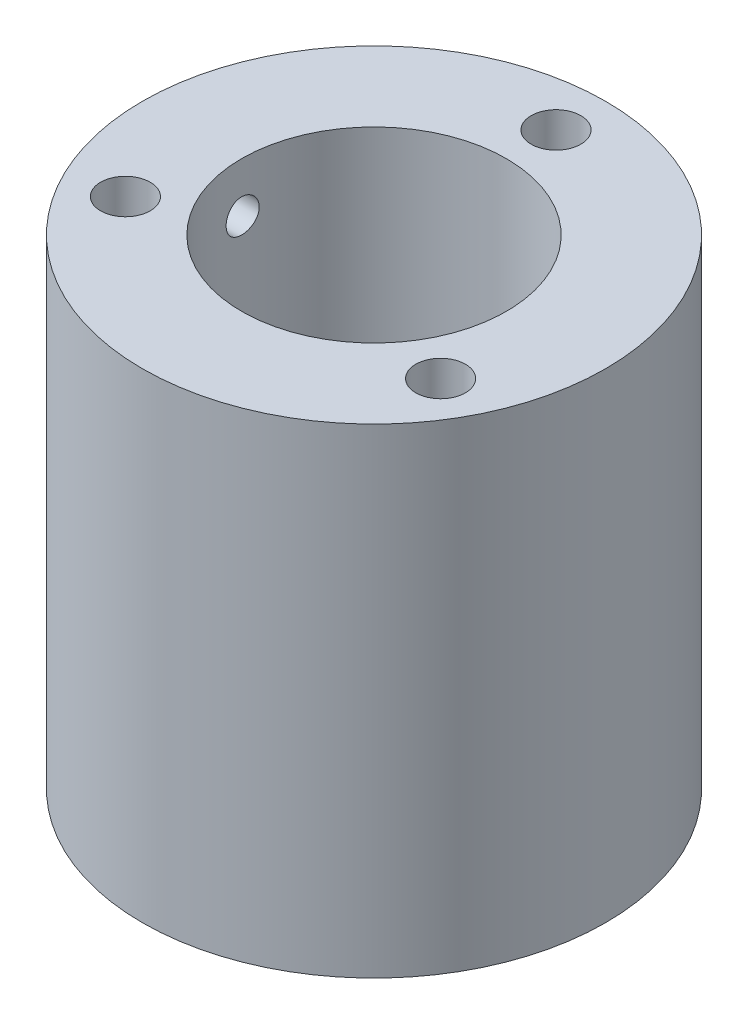
ISO-10303-21;
HEADER;
FILE_DESCRIPTION(('STEP AP214'),'2;1');
FILE_NAME('part.step','',(''),(''),'','','');
FILE_SCHEMA(('AUTOMOTIVE_DESIGN { 1 0 10303 214 1 1 1 1 }'));
ENDSEC;
DATA;
#1=APPLICATION_CONTEXT('core data for automotive mechanical design processes');
#2=APPLICATION_PROTOCOL_DEFINITION('international standard','automotive_design',2000,#1);
#3=PRODUCT_CONTEXT('',#1,'mechanical');
#4=PRODUCT('Part','Part','',(#3));
#5=PRODUCT_RELATED_PRODUCT_CATEGORY('part','',(#4));
#6=PRODUCT_DEFINITION_FORMATION('','',#4);
#7=PRODUCT_DEFINITION_CONTEXT('part definition',#1,'design');
#8=PRODUCT_DEFINITION('design','',#6,#7);
#9=PRODUCT_DEFINITION_SHAPE('','',#8);
#10=(LENGTH_UNIT() NAMED_UNIT(*) SI_UNIT(.MILLI.,.METRE.));
#11=(NAMED_UNIT(*) PLANE_ANGLE_UNIT() SI_UNIT($,.RADIAN.));
#12=(NAMED_UNIT(*) SI_UNIT($,.STERADIAN.) SOLID_ANGLE_UNIT());
#13=UNCERTAINTY_MEASURE_WITH_UNIT(LENGTH_MEASURE(1.E-05),#10,'distance_accuracy_value','');
#14=(GEOMETRIC_REPRESENTATION_CONTEXT(3) GLOBAL_UNCERTAINTY_ASSIGNED_CONTEXT((#13)) GLOBAL_UNIT_ASSIGNED_CONTEXT((#10,
#11,#12)) REPRESENTATION_CONTEXT('',''));
#15=CARTESIAN_POINT('',(0.,0.,0.));
#16=DIRECTION('',(0.,0.,1.));
#17=DIRECTION('',(1.,0.,0.));
#18=AXIS2_PLACEMENT_3D('',#15,#16,#17);
#19=CARTESIAN_POINT('',(0.,0.,0.));
#20=DIRECTION('',(0.,-1.,0.));
#21=DIRECTION('',(1.,0.,0.));
#22=AXIS2_PLACEMENT_3D('',#19,#20,#21);
#23=CYLINDRICAL_SURFACE('',#22,3.);
#24=CARTESIAN_POINT('',(0.,0.,0.));
#25=DIRECTION('',(0.,-1.,0.));
#26=DIRECTION('',(1.,0.,0.));
#27=AXIS2_PLACEMENT_3D('',#24,#25,#26);
#28=CIRCLE('',#27,3.);
#29=CARTESIAN_POINT('',(3.,0.,0.));
#30=VERTEX_POINT('',#29);
#31=EDGE_CURVE('E10',#30,#30,#28,.T.);
#32=ORIENTED_EDGE('',*,*,#31,.T.);
#33=EDGE_LOOP('',(#32));
#34=FACE_BOUND('',#33,.T.);
#35=CARTESIAN_POINT('',(0.,7.,0.));
#36=DIRECTION('',(0.,1.,0.));
#37=DIRECTION('',(-1.,0.,0.));
#38=AXIS2_PLACEMENT_3D('',#35,#36,#37);
#39=CIRCLE('',#38,3.);
#40=CARTESIAN_POINT('',(-3.,7.,0.));
#41=VERTEX_POINT('',#40);
#42=EDGE_CURVE('E51',#41,#41,#39,.T.);
#43=ORIENTED_EDGE('',*,*,#42,.T.);
#44=EDGE_LOOP('',(#43));
#45=FACE_BOUND('',#44,.T.);
#46=ADVANCED_FACE('F31',(#34,#45),#23,.F.);
#47=CARTESIAN_POINT('',(8.,0.,0.));
#48=DIRECTION('',(0.,-1.,0.));
#49=DIRECTION('',(1.,0.,0.));
#50=AXIS2_PLACEMENT_3D('',#47,#48,#49);
#51=PLANE('',#50);
#52=CARTESIAN_POINT('',(0.,0.,0.));
#53=DIRECTION('',(0.,-1.,0.));
#54=DIRECTION('',(1.,0.,0.));
#55=AXIS2_PLACEMENT_3D('',#52,#53,#54);
#56=CIRCLE('',#55,8.);
#57=CARTESIAN_POINT('',(8.,0.,0.));
#58=VERTEX_POINT('',#57);
#59=EDGE_CURVE('E82',#58,#58,#56,.T.);
#60=ORIENTED_EDGE('',*,*,#59,.T.);
#61=EDGE_LOOP('',(#60));
#62=FACE_BOUND('',#61,.T.);
#63=ORIENTED_EDGE('',*,*,#31,.F.);
#64=EDGE_LOOP('',(#63));
#65=FACE_BOUND('',#64,.T.);
#66=ADVANCED_FACE('F33',(#62,#65),#51,.T.);
#67=CARTESIAN_POINT('',(8.,30.5,0.));
#68=DIRECTION('',(0.,1.,0.));
#69=DIRECTION('',(-1.,0.,0.));
#70=AXIS2_PLACEMENT_3D('',#67,#68,#69);
#71=PLANE('',#70);
#72=CARTESIAN_POINT('',(-9.52627944162812,30.5,5.50000000000041));
#73=DIRECTION('',(0.,1.,0.));
#74=DIRECTION('',(-1.,0.,0.));
#75=AXIS2_PLACEMENT_3D('',#72,#73,#74);
#76=CIRCLE('',#75,1.50000000000089);
#77=CARTESIAN_POINT('',(-11.026279441629,30.5,5.50000000000041));
#78=VERTEX_POINT('',#77);
#79=EDGE_CURVE('E53',#78,#78,#76,.T.);
#80=ORIENTED_EDGE('',*,*,#79,.F.);
#81=EDGE_LOOP('',(#80));
#82=FACE_BOUND('',#81,.T.);
#83=CARTESIAN_POINT('',(9.52627944162952,30.5,5.49999999999959));
#84=DIRECTION('',(0.,1.,0.));
#85=DIRECTION('',(-1.,0.,0.));
#86=AXIS2_PLACEMENT_3D('',#83,#84,#85);
#87=CIRCLE('',#86,1.50000000000061);
#88=CARTESIAN_POINT('',(8.02627944162892,30.5,5.49999999999959));
#89=VERTEX_POINT('',#88);
#90=EDGE_CURVE('E71',#89,#89,#87,.T.);
#91=ORIENTED_EDGE('',*,*,#90,.F.);
#92=EDGE_LOOP('',(#91));
#93=FACE_BOUND('',#92,.T.);
#94=CARTESIAN_POINT('',(0.,30.5,-11.));
#95=DIRECTION('',(0.,1.,0.));
#96=DIRECTION('',(-1.,0.,0.));
#97=AXIS2_PLACEMENT_3D('',#94,#95,#96);
#98=CIRCLE('',#97,1.5);
#99=CARTESIAN_POINT('',(-1.5,30.5,-11.));
#100=VERTEX_POINT('',#99);
#101=EDGE_CURVE('E76',#100,#100,#98,.T.);
#102=ORIENTED_EDGE('',*,*,#101,.F.);
#103=EDGE_LOOP('',(#102));
#104=FACE_BOUND('',#103,.T.);
#105=CARTESIAN_POINT('',(0.,30.5,0.));
#106=DIRECTION('',(0.,1.,0.));
#107=DIRECTION('',(-1.,0.,0.));
#108=AXIS2_PLACEMENT_3D('',#105,#106,#107);
#109=CIRCLE('',#108,8.);
#110=CARTESIAN_POINT('',(-8.,30.5,0.));
#111=VERTEX_POINT('',#110);
#112=EDGE_CURVE('E54',#111,#111,#109,.T.);
#113=ORIENTED_EDGE('',*,*,#112,.F.);
#114=EDGE_LOOP('',(#113));
#115=FACE_BOUND('',#114,.T.);
#116=CARTESIAN_POINT('',(0.,30.5,0.));
#117=DIRECTION('',(0.,-1.,0.));
#118=DIRECTION('',(1.,0.,0.));
#119=AXIS2_PLACEMENT_3D('',#116,#117,#118);
#120=CIRCLE('',#119,14.);
#121=CARTESIAN_POINT('',(14.,30.5,0.));
#122=VERTEX_POINT('',#121);
#123=EDGE_CURVE('E43',#122,#122,#120,.T.);
#124=ORIENTED_EDGE('',*,*,#123,.F.);
#125=EDGE_LOOP('',(#124));
#126=FACE_BOUND('',#125,.T.);
#127=ADVANCED_FACE('F97',(#82,#93,#104,#115,#126),#71,.T.);
#128=CARTESIAN_POINT('',(0.,0.,0.));
#129=DIRECTION('',(0.,-1.,0.));
#130=DIRECTION('',(1.,0.,0.));
#131=AXIS2_PLACEMENT_3D('',#128,#129,#130);
#132=CYLINDRICAL_SURFACE('',#131,14.);
#133=CARTESIAN_POINT('',(-13.9642400437689,27.5,-1.));
#134=CARTESIAN_POINT('',(-13.9642405203937,27.4439064862475,-0.999997538488355));
#135=CARTESIAN_POINT('',(-13.9645816664233,27.3877741240776,-0.995264409071027));
#136=CARTESIAN_POINT('',(-13.9659094817195,27.2770605944301,-0.976451657186973));
#137=CARTESIAN_POINT('',(-13.9668968944852,27.2224812892277,-0.962361269366147));
#138=CARTESIAN_POINT('',(-13.9694048346482,27.1164935210599,-0.925241893623878));
#139=CARTESIAN_POINT('',(-13.970925072399,27.065083353152,-0.902217761409243));
#140=CARTESIAN_POINT('',(-13.9743270033516,26.966870379804,-0.847892642183158));
#141=CARTESIAN_POINT('',(-13.9762086159273,26.9200665501602,-0.816593500822899));
#142=CARTESIAN_POINT('',(-13.9801253596357,26.8322919265856,-0.746541374331525));
#143=CARTESIAN_POINT('',(-13.9821607462646,26.791331182139,-0.707775810498677));
#144=CARTESIAN_POINT('',(-13.9861533396418,26.7164916147968,-0.623917545596144));
#145=CARTESIAN_POINT('',(-13.988110543066,26.6826130927471,-0.578824575880428));
#146=CARTESIAN_POINT('',(-13.9917285514192,26.6228675767621,-0.483533293162495));
#147=CARTESIAN_POINT('',(-13.9933890414199,26.5970090740229,-0.43332964339063));
#148=CARTESIAN_POINT('',(-13.9962238066368,26.5540919608081,-0.329279441658636));
#149=CARTESIAN_POINT('',(-13.9973980883565,26.5370332326255,-0.275432938436658));
#150=CARTESIAN_POINT('',(-13.9991263510329,26.512228271237,-0.165723869393624));
#151=CARTESIAN_POINT('',(-13.9996813966491,26.5044660527448,-0.109864934843977));
#152=CARTESIAN_POINT('',(-14.0001122433894,26.4984250657182,0.0023655614120201));
#153=CARTESIAN_POINT('',(-13.9999880541307,26.5001461629123,0.0587371158490495));
#154=CARTESIAN_POINT('',(-13.9990753083075,26.5130098126578,0.170284352160479));
#155=CARTESIAN_POINT('',(-13.9982879641018,26.5241351727683,0.225462027967625));
#156=CARTESIAN_POINT('',(-13.9961389118663,26.5554648393326,0.333164758427453));
#157=CARTESIAN_POINT('',(-13.9947771996163,26.5756692124931,0.385689793587067));
#158=CARTESIAN_POINT('',(-13.9916305924559,26.6246027249088,0.486651254042147));
#159=CARTESIAN_POINT('',(-13.9898453128611,26.6533396194095,0.535083908088336));
#160=CARTESIAN_POINT('',(-13.986052376203,26.7185168035681,0.626444607533954));
#161=CARTESIAN_POINT('',(-13.9840447158462,26.7549572073268,0.669372571385366));
#162=CARTESIAN_POINT('',(-13.9800275472914,26.8346040209237,0.748605738244498));
#163=CARTESIAN_POINT('',(-13.9780180449804,26.8778253596881,0.784895936370593));
#164=CARTESIAN_POINT('',(-13.9742282177889,26.9697549548497,0.849707645100839));
#165=CARTESIAN_POINT('',(-13.9724478930328,27.0184632142245,0.878229151489125));
#166=CARTESIAN_POINT('',(-13.9693175502356,27.1199939335926,0.926692983635403));
#167=CARTESIAN_POINT('',(-13.9679675667899,27.1728167239321,0.946634619695545));
#168=CARTESIAN_POINT('',(-13.9658513103158,27.2810724318437,0.977361987844122));
#169=CARTESIAN_POINT('',(-13.9650850283022,27.3365053092244,0.988147860869645));
#170=CARTESIAN_POINT('',(-13.9642242865475,27.4482766081982,1.00023871930709));
#171=CARTESIAN_POINT('',(-13.9641283469661,27.5046127597684,1.00156458865312));
#172=CARTESIAN_POINT('',(-13.9646152408324,27.6167066025047,0.994752423331228));
#173=CARTESIAN_POINT('',(-13.9651980696495,27.6724642976146,0.986614453227001));
#174=CARTESIAN_POINT('',(-13.9669754738103,27.7817590629912,0.961122988518048));
#175=CARTESIAN_POINT('',(-13.9681694072923,27.8352983996157,0.943779162396539));
#176=CARTESIAN_POINT('',(-13.9710339443197,27.9387067158408,0.900378119737884));
#177=CARTESIAN_POINT('',(-13.9727045535057,27.9885756520002,0.87432080009193));
#178=CARTESIAN_POINT('',(-13.9763377819845,28.0833233590535,0.814179279780773));
#179=CARTESIAN_POINT('',(-13.9783009070333,28.128193247059,0.780081115906834));
#180=CARTESIAN_POINT('',(-13.9822962110106,28.2115795677299,0.704846089297059));
#181=CARTESIAN_POINT('',(-13.9843283908157,28.2500959196995,0.663709137175631));
#182=CARTESIAN_POINT('',(-13.9882371791169,28.3197526658179,0.575474234520167));
#183=CARTESIAN_POINT('',(-13.9901134980917,28.3508795242768,0.528365583706534));
#184=CARTESIAN_POINT('',(-13.9934949867277,28.4047809869096,0.429578135653666));
#185=CARTESIAN_POINT('',(-13.9950001592429,28.4275556553073,0.377899373559921));
#186=CARTESIAN_POINT('',(-13.9974684015413,28.4640828203073,0.2714879380357));
#187=CARTESIAN_POINT('',(-13.9984319812725,28.4778438059549,0.216758190886675));
#188=CARTESIAN_POINT('',(-13.9997105173473,28.4959807487734,0.105757897323166));
#189=CARTESIAN_POINT('',(-14.0000254823903,28.5003568318186,0.0494873715845268));
#190=CARTESIAN_POINT('',(-13.9999713228965,28.4995984418556,-0.0628634206029759));
#191=CARTESIAN_POINT('',(-13.999603719472,28.4944851161253,-0.118943831754038));
#192=CARTESIAN_POINT('',(-13.998228758943,28.4749370045103,-0.229447486667536));
#193=CARTESIAN_POINT('',(-13.9972214008013,28.4605022035118,-0.283870727742869));
#194=CARTESIAN_POINT('',(-13.9946800742266,28.4227259259988,-0.38951757941589));
#195=CARTESIAN_POINT('',(-13.9931461184151,28.3993846629522,-0.4407412666654));
#196=CARTESIAN_POINT('',(-13.989723581538,28.3444606980534,-0.538545901074291));
#197=CARTESIAN_POINT('',(-13.987835008249,28.3128781769217,-0.58512695000989));
#198=CARTESIAN_POINT('',(-13.983910483972,28.2422892971614,-0.672431852610341));
#199=CARTESIAN_POINT('',(-13.9818742311411,28.2032674522789,-0.713143171291755));
#200=CARTESIAN_POINT('',(-13.9778863554286,28.1189322512332,-0.787452691686209));
#201=CARTESIAN_POINT('',(-13.9759347532911,28.0736173642239,-0.821049157603013));
#202=CARTESIAN_POINT('',(-13.9723339518161,27.9779165691704,-0.880208141511714));
#203=CARTESIAN_POINT('',(-13.970685206218,27.9275232246992,-0.905758645297685));
#204=CARTESIAN_POINT('',(-13.9678824747005,27.8231858117285,-0.948004002630864));
#205=CARTESIAN_POINT('',(-13.9667279137906,27.7692459544418,-0.96470915325774));
#206=CARTESIAN_POINT('',(-13.9653446437272,27.6791505177616,-0.984481986906043));
#207=CARTESIAN_POINT('',(-13.9649322905572,27.6435762208054,-0.990293634496187));
#208=CARTESIAN_POINT('',(-13.9643798378402,27.5720066191317,-0.998053427544209));
#209=CARTESIAN_POINT('',(-13.964239737782,27.536011315205,-1.00000158025885));
#210=CARTESIAN_POINT('',(-13.9642400437689,27.5,-1.));
#211=B_SPLINE_CURVE_WITH_KNOTS('',3,(#133,#134,#135,#136,#137,#138,#139,#140,#141,#142,#143,
#144,#145,#146,#147,#148,#149,#150,#151,#152,#153,#154,#155,#156,#157,#158,#159,#160,#161,#162,
#163,#164,#165,#166,#167,#168,#169,#170,#171,#172,#173,#174,#175,#176,#177,#178,#179,#180,#181,
#182,#183,#184,#185,#186,#187,#188,#189,#190,#191,#192,#193,#194,#195,#196,#197,#198,#199,#200,
#201,#202,#203,#204,#205,#206,#207,#208,#209,#210),.UNSPECIFIED.,.T.,.F.,(4,2,2,2,2,2,2,2,2,2,2,
2,2,2,2,2,2,2,2,2,2,2,2,2,2,2,2,2,2,2,2,2,2,2,2,2,2,2,4),(0.,0.168149069736299,
0.336491927811284,0.504743415339148,0.672957407806302,0.841457309614469,1.00996436767829,
1.17864922833733,1.34733183258856,1.51572396988245,1.6841137229665,1.85219629776977,
2.02028010755697,2.18851715955513,2.35675670357604,2.52537198094741,2.69398734982168,
2.86261627040885,3.03124259519923,3.19949654447378,3.36774934590182,3.53582578785858,
3.70390421877356,3.87227670153391,4.04065132261562,4.20933202405057,4.37801142839446,
4.54653174195183,4.7150497952273,4.88319275459045,5.05133598658302,5.21947518881614,
5.38761070427967,5.55610012238256,5.72463059927318,5.89341154501829,6.06199557457905,
6.16994531992751,6.27789486251478),.UNSPECIFIED.);
#212=CARTESIAN_POINT('',(-13.9642400437689,27.5,-1.));
#213=VERTEX_POINT('',#212);
#214=EDGE_CURVE('E66',#213,#213,#211,.T.);
#215=ORIENTED_EDGE('',*,*,#214,.F.);
#216=EDGE_LOOP('',(#215));
#217=FACE_BOUND('',#216,.T.);
#218=ORIENTED_EDGE('',*,*,#123,.T.);
#219=EDGE_LOOP('',(#218));
#220=FACE_BOUND('',#219,.T.);
#221=CARTESIAN_POINT('',(0.,1.5,0.));
#222=DIRECTION('',(0.,-1.,0.));
#223=DIRECTION('',(1.,0.,0.));
#224=AXIS2_PLACEMENT_3D('',#221,#222,#223);
#225=CIRCLE('',#224,14.);
#226=CARTESIAN_POINT('',(14.,1.5,0.));
#227=VERTEX_POINT('',#226);
#228=EDGE_CURVE('E48',#227,#227,#225,.T.);
#229=ORIENTED_EDGE('',*,*,#228,.F.);
#230=EDGE_LOOP('',(#229));
#231=FACE_BOUND('',#230,.T.);
#232=ADVANCED_FACE('F95',(#217,#220,#231),#132,.T.);
#233=CARTESIAN_POINT('',(8.,1.5,0.));
#234=DIRECTION('',(0.,-1.,0.));
#235=DIRECTION('',(1.,0.,0.));
#236=AXIS2_PLACEMENT_3D('',#233,#234,#235);
#237=PLANE('',#236);
#238=ORIENTED_EDGE('',*,*,#228,.T.);
#239=EDGE_LOOP('',(#238));
#240=FACE_BOUND('',#239,.T.);
#241=CARTESIAN_POINT('',(0.,1.5,0.));
#242=DIRECTION('',(0.,-1.,0.));
#243=DIRECTION('',(1.,0.,0.));
#244=AXIS2_PLACEMENT_3D('',#241,#242,#243);
#245=CIRCLE('',#244,8.);
#246=CARTESIAN_POINT('',(8.,1.5,0.));
#247=VERTEX_POINT('',#246);
#248=EDGE_CURVE('E87',#247,#247,#245,.T.);
#249=ORIENTED_EDGE('',*,*,#248,.F.);
#250=EDGE_LOOP('',(#249));
#251=FACE_BOUND('',#250,.T.);
#252=ADVANCED_FACE('F92',(#240,#251),#237,.T.);
#253=CARTESIAN_POINT('',(0.,0.,0.));
#254=DIRECTION('',(0.,-1.,0.));
#255=DIRECTION('',(1.,0.,0.));
#256=AXIS2_PLACEMENT_3D('',#253,#254,#255);
#257=CYLINDRICAL_SURFACE('',#256,8.);
#258=ORIENTED_EDGE('',*,*,#248,.T.);
#259=EDGE_LOOP('',(#258));
#260=FACE_BOUND('',#259,.T.);
#261=ORIENTED_EDGE('',*,*,#59,.F.);
#262=EDGE_LOOP('',(#261));
#263=FACE_BOUND('',#262,.T.);
#264=ADVANCED_FACE('F105',(#260,#263),#257,.T.);
#265=CARTESIAN_POINT('',(0.,20.5,-11.));
#266=DIRECTION('',(0.,1.,0.));
#267=DIRECTION('',(-1.,0.,0.));
#268=AXIS2_PLACEMENT_3D('',#265,#266,#267);
#269=CYLINDRICAL_SURFACE('',#268,1.5);
#270=CARTESIAN_POINT('',(0.,20.5,-11.));
#271=DIRECTION('',(0.,1.,0.));
#272=DIRECTION('',(-1.,0.,0.));
#273=AXIS2_PLACEMENT_3D('',#270,#271,#272);
#274=CIRCLE('',#273,1.5);
#275=CARTESIAN_POINT('',(-1.5,20.5,-11.));
#276=VERTEX_POINT('',#275);
#277=EDGE_CURVE('E79',#276,#276,#274,.T.);
#278=ORIENTED_EDGE('',*,*,#277,.F.);
#279=EDGE_LOOP('',(#278));
#280=FACE_BOUND('',#279,.T.);
#281=ORIENTED_EDGE('',*,*,#101,.T.);
#282=EDGE_LOOP('',(#281));
#283=FACE_BOUND('',#282,.T.);
#284=ADVANCED_FACE('F126',(#280,#283),#269,.F.);
#285=CARTESIAN_POINT('',(0.,20.5,-11.));
#286=DIRECTION('',(0.,1.,0.));
#287=DIRECTION('',(-1.,0.,0.));
#288=AXIS2_PLACEMENT_3D('',#285,#286,#287);
#289=PLANE('',#288);
#290=ORIENTED_EDGE('',*,*,#277,.T.);
#291=EDGE_LOOP('',(#290));
#292=FACE_BOUND('',#291,.T.);
#293=ADVANCED_FACE('F132',(#292),#289,.T.);
#294=CARTESIAN_POINT('',(9.52627944162953,20.5,5.49999999999959));
#295=DIRECTION('',(0.,1.,0.));
#296=DIRECTION('',(-1.,0.,0.));
#297=AXIS2_PLACEMENT_3D('',#294,#295,#296);
#298=CYLINDRICAL_SURFACE('',#297,1.50000000000061);
#299=CARTESIAN_POINT('',(9.52627944162953,20.5,5.49999999999959));
#300=DIRECTION('',(0.,1.,0.));
#301=DIRECTION('',(-1.,0.,0.));
#302=AXIS2_PLACEMENT_3D('',#299,#300,#301);
#303=CIRCLE('',#302,1.50000000000061);
#304=CARTESIAN_POINT('',(8.02627944162892,20.5,5.49999999999959));
#305=VERTEX_POINT('',#304);
#306=EDGE_CURVE('E73',#305,#305,#303,.T.);
#307=ORIENTED_EDGE('',*,*,#306,.F.);
#308=EDGE_LOOP('',(#307));
#309=FACE_BOUND('',#308,.T.);
#310=ORIENTED_EDGE('',*,*,#90,.T.);
#311=EDGE_LOOP('',(#310));
#312=FACE_BOUND('',#311,.T.);
#313=ADVANCED_FACE('F138',(#309,#312),#298,.F.);
#314=CARTESIAN_POINT('',(9.52627944162953,20.5,5.49999999999959));
#315=DIRECTION('',(0.,1.,0.));
#316=DIRECTION('',(-1.,0.,0.));
#317=AXIS2_PLACEMENT_3D('',#314,#315,#316);
#318=PLANE('',#317);
#319=ORIENTED_EDGE('',*,*,#306,.T.);
#320=EDGE_LOOP('',(#319));
#321=FACE_BOUND('',#320,.T.);
#322=ADVANCED_FACE('F142',(#321),#318,.T.);
#323=CARTESIAN_POINT('',(-9.52627944162812,20.5,5.50000000000041));
#324=DIRECTION('',(0.,1.,0.));
#325=DIRECTION('',(-1.,0.,0.));
#326=AXIS2_PLACEMENT_3D('',#323,#324,#325);
#327=CYLINDRICAL_SURFACE('',#326,1.50000000000089);
#328=CARTESIAN_POINT('',(-9.52627944162812,20.5,5.50000000000041));
#329=DIRECTION('',(0.,1.,0.));
#330=DIRECTION('',(-1.,0.,0.));
#331=AXIS2_PLACEMENT_3D('',#328,#329,#330);
#332=CIRCLE('',#331,1.50000000000089);
#333=CARTESIAN_POINT('',(-11.026279441629,20.5,5.50000000000041));
#334=VERTEX_POINT('',#333);
#335=EDGE_CURVE('E58',#334,#334,#332,.T.);
#336=ORIENTED_EDGE('',*,*,#335,.F.);
#337=EDGE_LOOP('',(#336));
#338=FACE_BOUND('',#337,.T.);
#339=ORIENTED_EDGE('',*,*,#79,.T.);
#340=EDGE_LOOP('',(#339));
#341=FACE_BOUND('',#340,.T.);
#342=ADVANCED_FACE('F146',(#338,#341),#327,.F.);
#343=CARTESIAN_POINT('',(-9.52627944162812,20.5,5.50000000000041));
#344=DIRECTION('',(0.,1.,0.));
#345=DIRECTION('',(-1.,0.,0.));
#346=AXIS2_PLACEMENT_3D('',#343,#344,#345);
#347=PLANE('',#346);
#348=ORIENTED_EDGE('',*,*,#335,.T.);
#349=EDGE_LOOP('',(#348));
#350=FACE_BOUND('',#349,.T.);
#351=ADVANCED_FACE('F150',(#350),#347,.T.);
#352=CARTESIAN_POINT('',(0.,7.,0.));
#353=DIRECTION('',(0.,1.,0.));
#354=DIRECTION('',(-1.,0.,0.));
#355=AXIS2_PLACEMENT_3D('',#352,#353,#354);
#356=CYLINDRICAL_SURFACE('',#355,8.);
#357=CARTESIAN_POINT('',(-8.,26.5,0.));
#358=CARTESIAN_POINT('',(-7.99999921958572,26.5000023763743,0.0559364382223044));
#359=CARTESIAN_POINT('',(-7.99940713821961,26.5047091516677,0.111907829721098));
#360=CARTESIAN_POINT('',(-7.99710216044544,26.5234111018283,0.222293120835901));
#361=CARTESIAN_POINT('',(-7.99538809376572,26.5374159751694,0.276705332249498));
#362=CARTESIAN_POINT('',(-7.99103224417763,26.5742950575656,0.382358229925221));
#363=CARTESIAN_POINT('',(-7.98839108582217,26.5971632967239,0.433601024058455));
#364=CARTESIAN_POINT('',(-7.98247480351239,26.6511069135879,0.531511789957214));
#365=CARTESIAN_POINT('',(-7.97919978833646,26.6821808834123,0.578180544622548));
#366=CARTESIAN_POINT('',(-7.9723612852253,26.7518367799358,0.665885126772526));
#367=CARTESIAN_POINT('',(-7.96879645876967,26.7904548517385,0.70689214597485));
#368=CARTESIAN_POINT('',(-7.961790904039,26.8740251294147,0.781861117422997));
#369=CARTESIAN_POINT('',(-7.95835018209707,26.9189776579653,0.8158227105569));
#370=CARTESIAN_POINT('',(-7.95196922247834,27.0141279910263,0.875844064513575));
#371=CARTESIAN_POINT('',(-7.94903070871165,27.0643429446272,0.901876838376429));
#372=CARTESIAN_POINT('',(-7.94400451383073,27.1684748207789,0.945129230630047));
#373=CARTESIAN_POINT('',(-7.94191680045255,27.2223916028588,0.962349183226086));
#374=CARTESIAN_POINT('',(-7.93884135841446,27.3320976782347,0.987399592009905));
#375=CARTESIAN_POINT('',(-7.93784793374698,27.3878757030817,0.99527868589268));
#376=CARTESIAN_POINT('',(-7.93705611257117,27.4999705053887,1.00157421982289));
#377=CARTESIAN_POINT('',(-7.93725766800603,27.5562872610925,0.999991040400967));
#378=CARTESIAN_POINT('',(-7.93882782147901,27.6675219308995,0.987446894579162));
#379=CARTESIAN_POINT('',(-7.94018975184131,27.7224459944801,0.97653950519388));
#380=CARTESIAN_POINT('',(-7.94391679903051,27.8296780084876,0.945740153272822));
#381=CARTESIAN_POINT('',(-7.94628193618289,27.8819859058856,0.925848008700762));
#382=CARTESIAN_POINT('',(-7.95175646345861,27.9826671996087,0.87758622396466));
#383=CARTESIAN_POINT('',(-7.95486789284578,28.0310293200996,0.849193301483054));
#384=CARTESIAN_POINT('',(-7.96148284572239,28.1223226777653,0.784752587782767));
#385=CARTESIAN_POINT('',(-7.96498638714265,28.1652536663895,0.74870444643231));
#386=CARTESIAN_POINT('',(-7.9720204395617,28.2447770842891,0.669679644301512));
#387=CARTESIAN_POINT('',(-7.97555096954756,28.2813236367064,0.626656803136005));
#388=CARTESIAN_POINT('',(-7.98221853022341,28.3466835520122,0.535062867645571));
#389=CARTESIAN_POINT('',(-7.98535556000602,28.3754968970688,0.486491760527303));
#390=CARTESIAN_POINT('',(-7.99088460887432,28.4245725281856,0.385144668545395));
#391=CARTESIAN_POINT('',(-7.99327637760615,28.4448319415525,0.332367278135088));
#392=CARTESIAN_POINT('',(-7.99704314312025,28.4761881974093,0.224123176172424));
#393=CARTESIAN_POINT('',(-7.99841818750348,28.4872854688548,0.168656590652268));
#394=CARTESIAN_POINT('',(-7.99999038564305,28.4999429697042,0.0570052655653998));
#395=CARTESIAN_POINT('',(-8.00019534457055,28.5015663969456,0.000827796079443581));
#396=CARTESIAN_POINT('',(-7.99942535202172,28.4953969063776,-0.110998414598998));
#397=CARTESIAN_POINT('',(-7.99845042567285,28.4876041890994,-0.166647167025882));
#398=CARTESIAN_POINT('',(-7.99543507502677,28.4628761164902,-0.275649803088608));
#399=CARTESIAN_POINT('',(-7.99339816325548,28.445970894639,-0.329010628169882));
#400=CARTESIAN_POINT('',(-7.98848689240079,28.4035290192348,-0.432139861943363));
#401=CARTESIAN_POINT('',(-7.9856125048825,28.3779920726034,-0.481908148586126));
#402=CARTESIAN_POINT('',(-7.97932729164045,28.318858744997,-0.576721808274971));
#403=CARTESIAN_POINT('',(-7.97591377617004,28.2852214840777,-0.621741503977528));
#404=CARTESIAN_POINT('',(-7.96894056930263,28.2109002009863,-0.705518795850528));
#405=CARTESIAN_POINT('',(-7.9653808721076,28.1702158990996,-0.744276143334744));
#406=CARTESIAN_POINT('',(-7.95849242185034,28.0826770332971,-0.814652783527207));
#407=CARTESIAN_POINT('',(-7.95516509888531,28.0357886614758,-0.846230184227174));
#408=CARTESIAN_POINT('',(-7.94914164414859,27.9373367020581,-0.901061155777402));
#409=CARTESIAN_POINT('',(-7.94644549972411,27.8857732082094,-0.924314893491347));
#410=CARTESIAN_POINT('',(-7.94199940157198,27.779569872341,-0.961770631546616));
#411=CARTESIAN_POINT('',(-7.94024698073915,27.7249384679808,-0.975996250982843));
#412=CARTESIAN_POINT('',(-7.93787966362982,27.6140390064877,-0.995067997547138));
#413=CARTESIAN_POINT('',(-7.93726471443511,27.5577710256164,-0.999914561014305));
#414=CARTESIAN_POINT('',(-7.93724350792982,27.4456124283181,-1.00008261443393));
#415=CARTESIAN_POINT('',(-7.93782889900782,27.3897219006672,-0.99546991907971));
#416=CARTESIAN_POINT('',(-7.94012445814881,27.279517148262,-0.976989761939731));
#417=CARTESIAN_POINT('',(-7.94183462633233,27.2252029236765,-0.963122299162308));
#418=CARTESIAN_POINT('',(-7.9461844630982,27.1197012172934,-0.926546829475863));
#419=CARTESIAN_POINT('',(-7.94882379837114,27.0685126219913,-0.903841992388374));
#420=CARTESIAN_POINT('',(-7.95473513297928,26.9706613383807,-0.850242760860124));
#421=CARTESIAN_POINT('',(-7.95800714024165,26.9239987067921,-0.819348263803836));
#422=CARTESIAN_POINT('',(-7.96484241900893,26.8361875098638,-0.750002532506336));
#423=CARTESIAN_POINT('',(-7.96840748833613,26.795077815618,-0.711502250309984));
#424=CARTESIAN_POINT('',(-7.9754113263716,26.7198772699328,-0.628140090787354));
#425=CARTESIAN_POINT('',(-7.97885006510236,26.6857880756903,-0.583276715656628));
#426=CARTESIAN_POINT('',(-7.98522822634699,26.6254858571579,-0.488266248341685));
#427=CARTESIAN_POINT('',(-7.98816570031321,26.5993032776403,-0.438099711838468));
#428=CARTESIAN_POINT('',(-7.9931905963069,26.5557715028335,-0.334073160920512));
#429=CARTESIAN_POINT('',(-7.9952789414783,26.5384127094586,-0.280217232348094));
#430=CARTESIAN_POINT('',(-7.99786688131099,26.5171762647315,-0.188402308787169));
#431=CARTESIAN_POINT('',(-7.99866290358182,26.5107444232072,-0.151022265406768));
#432=CARTESIAN_POINT('',(-7.99972972531676,26.5021555017227,-0.0757668252849737));
#433=CARTESIAN_POINT('',(-8.00000052865388,26.4999983902403,-0.0378914321984108));
#434=CARTESIAN_POINT('',(-8.,26.5,0.));
#435=B_SPLINE_CURVE_WITH_KNOTS('',3,(#357,#358,#359,#360,#361,#362,#363,#364,#365,#366,#367,
#368,#369,#370,#371,#372,#373,#374,#375,#376,#377,#378,#379,#380,#381,#382,#383,#384,#385,#386,
#387,#388,#389,#390,#391,#392,#393,#394,#395,#396,#397,#398,#399,#400,#401,#402,#403,#404,#405,
#406,#407,#408,#409,#410,#411,#412,#413,#414,#415,#416,#417,#418,#419,#420,#421,#422,#423,#424,
#425,#426,#427,#428,#429,#430,#431,#432,#433,#434),.UNSPECIFIED.,.T.,.F.,(4,2,2,2,2,2,2,2,2,2,2,
2,2,2,2,2,2,2,2,2,2,2,2,2,2,2,2,2,2,2,2,2,2,2,2,2,2,2,4),(0.,0.167670909110499,
0.335516984377371,0.503250203272706,0.670954662364293,0.839483252807372,1.00802043120004,
1.17712500127548,1.34622315798723,1.51443690114528,1.68264387953865,1.84989078576676,
2.01714108066497,2.18485370514214,2.35257400205456,2.52145391254567,2.69033421245245,
2.85927118292642,3.02820024361512,3.19600111756769,3.36379841800772,3.53104421557358,
3.69829569231579,3.86640961171369,4.03453020550036,4.2036078860303,4.37268217688615,
4.5413122971237,4.7099345720425,4.87738760480886,5.04484065551819,5.21223369882595,
5.37962883964906,5.54814095076732,5.71669279388006,5.88588561214742,6.05489399473614,
6.16847537275052,6.28205591320175),.UNSPECIFIED.);
#436=CARTESIAN_POINT('',(-8.,26.5,0.));
#437=VERTEX_POINT('',#436);
#438=EDGE_CURVE('E35',#437,#437,#435,.T.);
#439=ORIENTED_EDGE('',*,*,#438,.T.);
#440=EDGE_LOOP('',(#439));
#441=FACE_BOUND('',#440,.T.);
#442=ORIENTED_EDGE('',*,*,#112,.T.);
#443=EDGE_LOOP('',(#442));
#444=FACE_BOUND('',#443,.T.);
#445=CARTESIAN_POINT('',(0.,7.,0.));
#446=DIRECTION('',(0.,1.,0.));
#447=DIRECTION('',(-1.,0.,0.));
#448=AXIS2_PLACEMENT_3D('',#445,#446,#447);
#449=CIRCLE('',#448,8.);
#450=CARTESIAN_POINT('',(-8.,7.,0.));
#451=VERTEX_POINT('',#450);
#452=EDGE_CURVE('E61',#451,#451,#449,.T.);
#453=ORIENTED_EDGE('',*,*,#452,.F.);
#454=EDGE_LOOP('',(#453));
#455=FACE_BOUND('',#454,.T.);
#456=ADVANCED_FACE('F153',(#441,#444,#455),#356,.F.);
#457=CARTESIAN_POINT('',(0.,7.,0.));
#458=DIRECTION('',(0.,1.,0.));
#459=DIRECTION('',(-1.,0.,0.));
#460=AXIS2_PLACEMENT_3D('',#457,#458,#459);
#461=PLANE('',#460);
#462=ORIENTED_EDGE('',*,*,#42,.F.);
#463=EDGE_LOOP('',(#462));
#464=FACE_BOUND('',#463,.T.);
#465=ORIENTED_EDGE('',*,*,#452,.T.);
#466=EDGE_LOOP('',(#465));
#467=FACE_BOUND('',#466,.T.);
#468=ADVANCED_FACE('F157',(#464,#467),#461,.T.);
#469=CARTESIAN_POINT('',(-25.,27.5,0.));
#470=DIRECTION('',(1.,0.,0.));
#471=DIRECTION('',(0.,0.,-1.));
#472=AXIS2_PLACEMENT_3D('',#469,#470,#471);
#473=CYLINDRICAL_SURFACE('',#472,1.);
#474=ORIENTED_EDGE('',*,*,#214,.T.);
#475=EDGE_LOOP('',(#474));
#476=FACE_BOUND('',#475,.T.);
#477=ORIENTED_EDGE('',*,*,#438,.F.);
#478=EDGE_LOOP('',(#477));
#479=FACE_BOUND('',#478,.T.);
#480=ADVANCED_FACE('F160',(#476,#479),#473,.F.);
#481=CLOSED_SHELL('',(#46,#66,#127,#232,#252,#264,#284,#293,#313,#322,#342,#351,#456,#468,#480));
#482=MANIFOLD_SOLID_BREP('B2',#481);
#483=ADVANCED_BREP_SHAPE_REPRESENTATION('',(#18,#482),#14);
#484=SHAPE_DEFINITION_REPRESENTATION(#9,#483);
ENDSEC;
END-ISO-10303-21;
